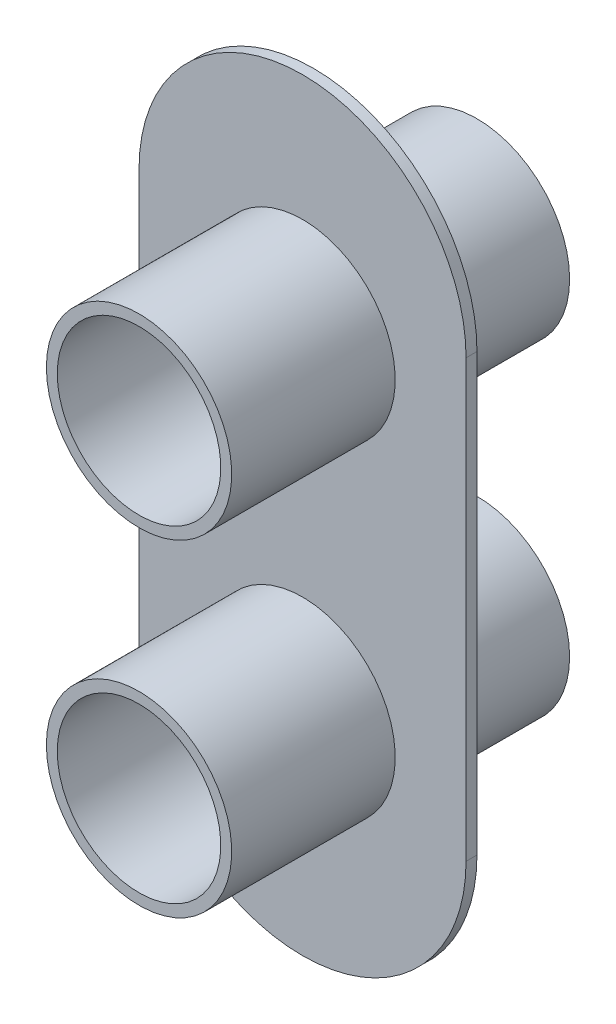
ISO-10303-21;
HEADER;
FILE_DESCRIPTION(('STEP AP214'),'2;1');
FILE_NAME('part.step','',(''),(''),'','','');
FILE_SCHEMA(('AUTOMOTIVE_DESIGN { 1 0 10303 214 1 1 1 1 }'));
ENDSEC;
DATA;
#1=APPLICATION_CONTEXT('core data for automotive mechanical design processes');
#2=APPLICATION_PROTOCOL_DEFINITION('international standard','automotive_design',2000,#1);
#3=PRODUCT_CONTEXT('',#1,'mechanical');
#4=PRODUCT('Part','Part','',(#3));
#5=PRODUCT_RELATED_PRODUCT_CATEGORY('part','',(#4));
#6=PRODUCT_DEFINITION_FORMATION('','',#4);
#7=PRODUCT_DEFINITION_CONTEXT('part definition',#1,'design');
#8=PRODUCT_DEFINITION('design','',#6,#7);
#9=PRODUCT_DEFINITION_SHAPE('','',#8);
#10=(LENGTH_UNIT() NAMED_UNIT(*) SI_UNIT(.MILLI.,.METRE.));
#11=(NAMED_UNIT(*) PLANE_ANGLE_UNIT() SI_UNIT($,.RADIAN.));
#12=(NAMED_UNIT(*) SI_UNIT($,.STERADIAN.) SOLID_ANGLE_UNIT());
#13=UNCERTAINTY_MEASURE_WITH_UNIT(LENGTH_MEASURE(1.E-05),#10,'distance_accuracy_value','');
#14=(GEOMETRIC_REPRESENTATION_CONTEXT(3) GLOBAL_UNCERTAINTY_ASSIGNED_CONTEXT((#13)) GLOBAL_UNIT_ASSIGNED_CONTEXT((#10,
#11,#12)) REPRESENTATION_CONTEXT('',''));
#15=CARTESIAN_POINT('',(0.,0.,0.));
#16=DIRECTION('',(0.,0.,1.));
#17=DIRECTION('',(1.,0.,0.));
#18=AXIS2_PLACEMENT_3D('',#15,#16,#17);
#19=CARTESIAN_POINT('',(0.,50.8,2.54));
#20=DIRECTION('',(0.,0.,-1.));
#21=DIRECTION('',(-1.,0.,0.));
#22=AXIS2_PLACEMENT_3D('',#19,#20,#21);
#23=CYLINDRICAL_SURFACE('',#22,38.1);
#24=CARTESIAN_POINT('',(0.,50.8,0.));
#25=DIRECTION('',(0.,0.,1.));
#26=DIRECTION('',(1.,0.,0.));
#27=AXIS2_PLACEMENT_3D('',#24,#25,#26);
#28=CIRCLE('',#27,38.1);
#29=CARTESIAN_POINT('',(38.1,50.8,0.));
#30=VERTEX_POINT('',#29);
#31=CARTESIAN_POINT('',(-38.1,50.8,0.));
#32=VERTEX_POINT('',#31);
#33=EDGE_CURVE('E106',#30,#32,#28,.T.);
#34=ORIENTED_EDGE('',*,*,#33,.T.);
#35=DIRECTION('',(0.,0.,-1.));
#36=VECTOR('',#35,1.);
#37=CARTESIAN_POINT('',(-38.1,50.8,2.54));
#38=LINE('',#37,#36);
#39=CARTESIAN_POINT('',(-38.1,50.8,2.54));
#40=VERTEX_POINT('',#39);
#41=EDGE_CURVE('E97',#40,#32,#38,.T.);
#42=ORIENTED_EDGE('',*,*,#41,.F.);
#43=CARTESIAN_POINT('',(0.,50.8,2.54));
#44=DIRECTION('',(0.,0.,1.));
#45=DIRECTION('',(1.,0.,0.));
#46=AXIS2_PLACEMENT_3D('',#43,#44,#45);
#47=CIRCLE('',#46,38.1);
#48=CARTESIAN_POINT('',(38.1,50.8,2.54));
#49=VERTEX_POINT('',#48);
#50=EDGE_CURVE('E91',#49,#40,#47,.T.);
#51=ORIENTED_EDGE('',*,*,#50,.F.);
#52=DIRECTION('',(0.,0.,-1.));
#53=VECTOR('',#52,1.);
#54=CARTESIAN_POINT('',(38.1,50.8,2.54));
#55=LINE('',#54,#53);
#56=EDGE_CURVE('E102',#49,#30,#55,.T.);
#57=ORIENTED_EDGE('',*,*,#56,.T.);
#58=EDGE_LOOP('',(#34,#42,#51,#57));
#59=FACE_BOUND('',#58,.T.);
#60=ADVANCED_FACE('F39',(#59),#23,.T.);
#61=CARTESIAN_POINT('',(-38.1,0.,2.54));
#62=DIRECTION('',(1.,0.,0.));
#63=DIRECTION('',(0.,1.,0.));
#64=AXIS2_PLACEMENT_3D('',#61,#62,#63);
#65=PLANE('',#64);
#66=DIRECTION('',(0.,-1.,0.));
#67=VECTOR('',#66,1.);
#68=CARTESIAN_POINT('',(-38.1,0.,0.));
#69=LINE('',#68,#67);
#70=CARTESIAN_POINT('',(-38.1,-50.8,0.));
#71=VERTEX_POINT('',#70);
#72=EDGE_CURVE('E96',#32,#71,#69,.T.);
#73=ORIENTED_EDGE('',*,*,#72,.T.);
#74=DIRECTION('',(0.,0.,-1.));
#75=VECTOR('',#74,1.);
#76=CARTESIAN_POINT('',(-38.1,-50.8,2.54));
#77=LINE('',#76,#75);
#78=CARTESIAN_POINT('',(-38.1,-50.8,2.54));
#79=VERTEX_POINT('',#78);
#80=EDGE_CURVE('E94',#79,#71,#77,.T.);
#81=ORIENTED_EDGE('',*,*,#80,.F.);
#82=DIRECTION('',(0.,-1.,0.));
#83=VECTOR('',#82,1.);
#84=CARTESIAN_POINT('',(-38.1,0.,2.54));
#85=LINE('',#84,#83);
#86=EDGE_CURVE('E86',#40,#79,#85,.T.);
#87=ORIENTED_EDGE('',*,*,#86,.F.);
#88=ORIENTED_EDGE('',*,*,#41,.T.);
#89=EDGE_LOOP('',(#73,#81,#87,#88));
#90=FACE_BOUND('',#89,.T.);
#91=ADVANCED_FACE('F95',(#90),#65,.F.);
#92=CARTESIAN_POINT('',(0.,-50.8,2.54));
#93=DIRECTION('',(0.,0.,-1.));
#94=DIRECTION('',(-1.,0.,0.));
#95=AXIS2_PLACEMENT_3D('',#92,#93,#94);
#96=CYLINDRICAL_SURFACE('',#95,38.1);
#97=CARTESIAN_POINT('',(0.,-50.8,0.));
#98=DIRECTION('',(0.,0.,1.));
#99=DIRECTION('',(1.,0.,0.));
#100=AXIS2_PLACEMENT_3D('',#97,#98,#99);
#101=CIRCLE('',#100,38.1);
#102=CARTESIAN_POINT('',(38.1,-50.8,0.));
#103=VERTEX_POINT('',#102);
#104=EDGE_CURVE('E72',#71,#103,#101,.T.);
#105=ORIENTED_EDGE('',*,*,#104,.T.);
#106=DIRECTION('',(0.,0.,-1.));
#107=VECTOR('',#106,1.);
#108=CARTESIAN_POINT('',(38.1,-50.8,2.54));
#109=LINE('',#108,#107);
#110=CARTESIAN_POINT('',(38.1,-50.8,2.54));
#111=VERTEX_POINT('',#110);
#112=EDGE_CURVE('E98',#111,#103,#109,.T.);
#113=ORIENTED_EDGE('',*,*,#112,.F.);
#114=CARTESIAN_POINT('',(0.,-50.8,2.54));
#115=DIRECTION('',(0.,0.,1.));
#116=DIRECTION('',(1.,0.,0.));
#117=AXIS2_PLACEMENT_3D('',#114,#115,#116);
#118=CIRCLE('',#117,38.1);
#119=EDGE_CURVE('E89',#79,#111,#118,.T.);
#120=ORIENTED_EDGE('',*,*,#119,.F.);
#121=ORIENTED_EDGE('',*,*,#80,.T.);
#122=EDGE_LOOP('',(#105,#113,#120,#121));
#123=FACE_BOUND('',#122,.T.);
#124=ADVANCED_FACE('F100',(#123),#96,.T.);
#125=CARTESIAN_POINT('',(38.1,0.,2.54));
#126=DIRECTION('',(-1.,0.,0.));
#127=DIRECTION('',(0.,0.,1.));
#128=AXIS2_PLACEMENT_3D('',#125,#126,#127);
#129=PLANE('',#128);
#130=DIRECTION('',(0.,1.,0.));
#131=VECTOR('',#130,1.);
#132=CARTESIAN_POINT('',(38.1,0.,0.));
#133=LINE('',#132,#131);
#134=EDGE_CURVE('E78',#103,#30,#133,.T.);
#135=ORIENTED_EDGE('',*,*,#134,.T.);
#136=ORIENTED_EDGE('',*,*,#56,.F.);
#137=DIRECTION('',(0.,1.,0.));
#138=VECTOR('',#137,1.);
#139=CARTESIAN_POINT('',(38.1,0.,2.54));
#140=LINE('',#139,#138);
#141=EDGE_CURVE('E55',#111,#49,#140,.T.);
#142=ORIENTED_EDGE('',*,*,#141,.F.);
#143=ORIENTED_EDGE('',*,*,#112,.T.);
#144=EDGE_LOOP('',(#135,#136,#142,#143));
#145=FACE_BOUND('',#144,.T.);
#146=ADVANCED_FACE('F131',(#145),#129,.F.);
#147=CARTESIAN_POINT('',(0.,0.,2.54));
#148=DIRECTION('',(0.,0.,1.));
#149=DIRECTION('',(1.,0.,0.));
#150=AXIS2_PLACEMENT_3D('',#147,#148,#149);
#151=PLANE('',#150);
#152=CARTESIAN_POINT('',(0.,38.1,2.54));
#153=DIRECTION('',(0.,0.,1.));
#154=DIRECTION('',(1.,0.,0.));
#155=AXIS2_PLACEMENT_3D('',#152,#153,#154);
#156=CIRCLE('',#155,21.59);
#157=CARTESIAN_POINT('',(-21.59,38.1,2.54));
#158=VERTEX_POINT('',#157);
#159=EDGE_CURVE('E284',#158,#158,#156,.T.);
#160=ORIENTED_EDGE('',*,*,#159,.F.);
#161=EDGE_LOOP('',(#160));
#162=FACE_BOUND('',#161,.T.);
#163=CARTESIAN_POINT('',(0.,-38.1,2.54));
#164=DIRECTION('',(0.,0.,1.));
#165=DIRECTION('',(1.,0.,0.));
#166=AXIS2_PLACEMENT_3D('',#163,#164,#165);
#167=CIRCLE('',#166,21.59);
#168=CARTESIAN_POINT('',(-21.59,-38.1,2.54));
#169=VERTEX_POINT('',#168);
#170=EDGE_CURVE('E11',#169,#169,#167,.T.);
#171=ORIENTED_EDGE('',*,*,#170,.F.);
#172=EDGE_LOOP('',(#171));
#173=FACE_BOUND('',#172,.T.);
#174=ORIENTED_EDGE('',*,*,#50,.T.);
#175=ORIENTED_EDGE('',*,*,#86,.T.);
#176=ORIENTED_EDGE('',*,*,#119,.T.);
#177=ORIENTED_EDGE('',*,*,#141,.T.);
#178=EDGE_LOOP('',(#174,#175,#176,#177));
#179=FACE_BOUND('',#178,.T.);
#180=ADVANCED_FACE('F87',(#162,#173,#179),#151,.T.);
#181=CARTESIAN_POINT('',(0.,0.,0.));
#182=DIRECTION('',(0.,0.,1.));
#183=DIRECTION('',(1.,0.,0.));
#184=AXIS2_PLACEMENT_3D('',#181,#182,#183);
#185=PLANE('',#184);
#186=CARTESIAN_POINT('',(0.,38.1,0.));
#187=DIRECTION('',(0.,0.,1.));
#188=DIRECTION('',(1.,0.,0.));
#189=AXIS2_PLACEMENT_3D('',#186,#187,#188);
#190=CIRCLE('',#189,21.59);
#191=CARTESIAN_POINT('',(21.59,38.1,0.));
#192=VERTEX_POINT('',#191);
#193=EDGE_CURVE('E47',#192,#192,#190,.F.);
#194=ORIENTED_EDGE('',*,*,#193,.F.);
#195=EDGE_LOOP('',(#194));
#196=FACE_BOUND('',#195,.T.);
#197=CARTESIAN_POINT('',(0.,-38.1,0.));
#198=DIRECTION('',(0.,0.,1.));
#199=DIRECTION('',(1.,0.,0.));
#200=AXIS2_PLACEMENT_3D('',#197,#198,#199);
#201=CIRCLE('',#200,21.59);
#202=CARTESIAN_POINT('',(21.59,-38.1,0.));
#203=VERTEX_POINT('',#202);
#204=EDGE_CURVE('E128',#203,#203,#201,.T.);
#205=ORIENTED_EDGE('',*,*,#204,.T.);
#206=EDGE_LOOP('',(#205));
#207=FACE_BOUND('',#206,.T.);
#208=ORIENTED_EDGE('',*,*,#33,.F.);
#209=ORIENTED_EDGE('',*,*,#134,.F.);
#210=ORIENTED_EDGE('',*,*,#104,.F.);
#211=ORIENTED_EDGE('',*,*,#72,.F.);
#212=EDGE_LOOP('',(#208,#209,#210,#211));
#213=FACE_BOUND('',#212,.T.);
#214=ADVANCED_FACE('F120',(#196,#207,#213),#185,.F.);
#215=CARTESIAN_POINT('',(0.,-38.1,-38.1));
#216=DIRECTION('',(0.,0.,1.));
#217=DIRECTION('',(1.,0.,0.));
#218=AXIS2_PLACEMENT_3D('',#215,#216,#217);
#219=CYLINDRICAL_SURFACE('',#218,21.59);
#220=CARTESIAN_POINT('',(0.,-38.1,-38.1));
#221=DIRECTION('',(0.,0.,1.));
#222=DIRECTION('',(1.,0.,0.));
#223=AXIS2_PLACEMENT_3D('',#220,#221,#222);
#224=CIRCLE('',#223,21.59);
#225=CARTESIAN_POINT('',(21.59,-38.1,-38.1));
#226=VERTEX_POINT('',#225);
#227=EDGE_CURVE('E109',#226,#226,#224,.T.);
#228=CARTESIAN_POINT('',(21.59,-38.1,-38.1));
#229=CARTESIAN_POINT('',(21.59,-38.1,-37.703125));
#230=CARTESIAN_POINT('',(21.59,-38.1,-37.30625));
#231=CARTESIAN_POINT('',(21.59,-38.1,-36.5125));
#232=CARTESIAN_POINT('',(21.59,-38.1,-36.115625));
#233=CARTESIAN_POINT('',(21.59,-38.1,-35.321875));
#234=CARTESIAN_POINT('',(21.59,-38.1,-34.925));
#235=CARTESIAN_POINT('',(21.59,-38.1,-34.13125));
#236=CARTESIAN_POINT('',(21.59,-38.1,-33.734375));
#237=CARTESIAN_POINT('',(21.59,-38.1,-32.940625));
#238=CARTESIAN_POINT('',(21.59,-38.1,-32.54375));
#239=CARTESIAN_POINT('',(21.59,-38.1,-31.75));
#240=CARTESIAN_POINT('',(21.59,-38.1,-31.353125));
#241=CARTESIAN_POINT('',(21.59,-38.1,-30.559375));
#242=CARTESIAN_POINT('',(21.59,-38.1,-30.1625));
#243=CARTESIAN_POINT('',(21.59,-38.1,-29.36875));
#244=CARTESIAN_POINT('',(21.59,-38.1,-28.971875));
#245=CARTESIAN_POINT('',(21.59,-38.1,-28.178125));
#246=CARTESIAN_POINT('',(21.59,-38.1,-27.78125));
#247=CARTESIAN_POINT('',(21.59,-38.1,-26.9875));
#248=CARTESIAN_POINT('',(21.59,-38.1,-26.590625));
#249=CARTESIAN_POINT('',(21.59,-38.1,-25.796875));
#250=CARTESIAN_POINT('',(21.59,-38.1,-25.4));
#251=CARTESIAN_POINT('',(21.59,-38.1,-24.60625));
#252=CARTESIAN_POINT('',(21.59,-38.1,-24.209375));
#253=CARTESIAN_POINT('',(21.59,-38.1,-23.415625));
#254=CARTESIAN_POINT('',(21.59,-38.1,-23.01875));
#255=CARTESIAN_POINT('',(21.59,-38.1,-22.225));
#256=CARTESIAN_POINT('',(21.59,-38.1,-21.828125));
#257=CARTESIAN_POINT('',(21.59,-38.1,-21.034375));
#258=CARTESIAN_POINT('',(21.59,-38.1,-20.6375));
#259=CARTESIAN_POINT('',(21.59,-38.1,-19.84375));
#260=CARTESIAN_POINT('',(21.59,-38.1,-19.446875));
#261=CARTESIAN_POINT('',(21.59,-38.1,-18.653125));
#262=CARTESIAN_POINT('',(21.59,-38.1,-18.25625));
#263=CARTESIAN_POINT('',(21.59,-38.1,-17.4625));
#264=CARTESIAN_POINT('',(21.59,-38.1,-17.065625));
#265=CARTESIAN_POINT('',(21.59,-38.1,-16.271875));
#266=CARTESIAN_POINT('',(21.59,-38.1,-15.875));
#267=CARTESIAN_POINT('',(21.59,-38.1,-15.08125));
#268=CARTESIAN_POINT('',(21.59,-38.1,-14.684375));
#269=CARTESIAN_POINT('',(21.59,-38.1,-13.890625));
#270=CARTESIAN_POINT('',(21.59,-38.1,-13.49375));
#271=CARTESIAN_POINT('',(21.59,-38.1,-12.7));
#272=CARTESIAN_POINT('',(21.59,-38.1,-12.303125));
#273=CARTESIAN_POINT('',(21.59,-38.1,-11.509375));
#274=CARTESIAN_POINT('',(21.59,-38.1,-11.1125));
#275=CARTESIAN_POINT('',(21.59,-38.1,-10.31875));
#276=CARTESIAN_POINT('',(21.59,-38.1,-9.921875));
#277=CARTESIAN_POINT('',(21.59,-38.1,-9.128125));
#278=CARTESIAN_POINT('',(21.59,-38.1,-8.73125));
#279=CARTESIAN_POINT('',(21.59,-38.1,-7.9375));
#280=CARTESIAN_POINT('',(21.59,-38.1,-7.540625));
#281=CARTESIAN_POINT('',(21.59,-38.1,-6.746875));
#282=CARTESIAN_POINT('',(21.59,-38.1,-6.35));
#283=CARTESIAN_POINT('',(21.59,-38.1,-5.55625));
#284=CARTESIAN_POINT('',(21.59,-38.1,-5.159375));
#285=CARTESIAN_POINT('',(21.59,-38.1,-4.365625));
#286=CARTESIAN_POINT('',(21.59,-38.1,-3.96875));
#287=CARTESIAN_POINT('',(21.59,-38.1,-3.175));
#288=CARTESIAN_POINT('',(21.59,-38.1,-2.778125));
#289=CARTESIAN_POINT('',(21.59,-38.1,-1.984375));
#290=CARTESIAN_POINT('',(21.59,-38.1,-1.5875));
#291=CARTESIAN_POINT('',(21.59,-38.1,-0.79375));
#292=CARTESIAN_POINT('',(21.59,-38.1,-0.396875));
#293=CARTESIAN_POINT('',(21.59,-38.1,0.));
#294=B_SPLINE_CURVE_WITH_KNOTS('',3,(#228,#229,#230,#231,#232,#233,#234,#235,#236,#237,#238,
#239,#240,#241,#242,#243,#244,#245,#246,#247,#248,#249,#250,#251,#252,#253,#254,#255,#256,#257,
#258,#259,#260,#261,#262,#263,#264,#265,#266,#267,#268,#269,#270,#271,#272,#273,#274,#275,#276,
#277,#278,#279,#280,#281,#282,#283,#284,#285,#286,#287,#288,#289,#290,#291,#292,#293),
.UNSPECIFIED.,.F.,.F.,(4,2,2,2,2,2,2,2,2,2,2,2,2,2,2,2,2,2,2,2,2,2,2,2,2,2,2,2,2,2,2,2,4),(0.,
1.19062499999999,2.38124999999999,3.571875,4.7625,5.953125,7.14375,8.334375,9.525,10.715625,
11.90625,13.096875,14.2875,15.478125,16.66875,17.859375,19.05,20.240625,21.43125,22.621875,
23.8125,25.003125,26.19375,27.384375,28.575,29.765625,30.95625,32.146875,33.3375,34.528125,
35.71875,36.909375,38.1),.UNSPECIFIED.);
#295=EDGE_CURVE('BSEAM123',#226,#203,#294,.T.);
#296=ORIENTED_EDGE('',*,*,#227,.T.);
#297=ORIENTED_EDGE('',*,*,#204,.F.);
#298=ORIENTED_EDGE('',*,*,#295,.T.);
#299=ORIENTED_EDGE('',*,*,#295,.F.);
#300=EDGE_LOOP('',(#296,#298,#297,#299));
#301=FACE_BOUND('',#300,.T.);
#302=ADVANCED_FACE('F123',(#301),#219,.T.);
#303=CARTESIAN_POINT('',(0.,-38.1,-38.1));
#304=DIRECTION('',(0.,0.,1.));
#305=DIRECTION('',(1.,0.,0.));
#306=AXIS2_PLACEMENT_3D('',#303,#304,#305);
#307=PLANE('',#306);
#308=CARTESIAN_POINT('',(0.,-38.1,-38.1));
#309=DIRECTION('',(0.,0.,1.));
#310=DIRECTION('',(1.,0.,0.));
#311=AXIS2_PLACEMENT_3D('',#308,#309,#310);
#312=CIRCLE('',#311,19.05);
#313=CARTESIAN_POINT('',(19.05,-38.1,-38.1));
#314=VERTEX_POINT('',#313);
#315=EDGE_CURVE('E279',#314,#314,#312,.T.);
#316=ORIENTED_EDGE('',*,*,#315,.T.);
#317=EDGE_LOOP('',(#316));
#318=FACE_BOUND('',#317,.T.);
#319=ORIENTED_EDGE('',*,*,#227,.F.);
#320=EDGE_LOOP('',(#319));
#321=FACE_BOUND('',#320,.T.);
#322=ADVANCED_FACE('F172',(#318,#321),#307,.F.);
#323=CARTESIAN_POINT('',(0.,38.1,-38.1));
#324=DIRECTION('',(0.,0.,1.));
#325=DIRECTION('',(1.,0.,0.));
#326=AXIS2_PLACEMENT_3D('',#323,#324,#325);
#327=CYLINDRICAL_SURFACE('',#326,21.59);
#328=CARTESIAN_POINT('',(0.,38.1,-38.1));
#329=DIRECTION('',(0.,0.,-1.));
#330=DIRECTION('',(-1.,0.,0.));
#331=AXIS2_PLACEMENT_3D('',#328,#329,#330);
#332=CIRCLE('',#331,21.59);
#333=CARTESIAN_POINT('',(21.59,38.1,-38.1));
#334=VERTEX_POINT('',#333);
#335=EDGE_CURVE('E296',#334,#334,#332,.T.);
#336=CARTESIAN_POINT('',(21.59,38.1,-38.1));
#337=CARTESIAN_POINT('',(21.59,38.1,-37.703125));
#338=CARTESIAN_POINT('',(21.59,38.1,-37.30625));
#339=CARTESIAN_POINT('',(21.59,38.1,-36.5125));
#340=CARTESIAN_POINT('',(21.59,38.1,-36.115625));
#341=CARTESIAN_POINT('',(21.59,38.1,-35.321875));
#342=CARTESIAN_POINT('',(21.59,38.1,-34.925));
#343=CARTESIAN_POINT('',(21.59,38.1,-34.13125));
#344=CARTESIAN_POINT('',(21.59,38.1,-33.734375));
#345=CARTESIAN_POINT('',(21.59,38.1,-32.940625));
#346=CARTESIAN_POINT('',(21.59,38.1,-32.54375));
#347=CARTESIAN_POINT('',(21.59,38.1,-31.75));
#348=CARTESIAN_POINT('',(21.59,38.1,-31.353125));
#349=CARTESIAN_POINT('',(21.59,38.1,-30.559375));
#350=CARTESIAN_POINT('',(21.59,38.1,-30.1625));
#351=CARTESIAN_POINT('',(21.59,38.1,-29.36875));
#352=CARTESIAN_POINT('',(21.59,38.1,-28.971875));
#353=CARTESIAN_POINT('',(21.59,38.1,-28.178125));
#354=CARTESIAN_POINT('',(21.59,38.1,-27.78125));
#355=CARTESIAN_POINT('',(21.59,38.1,-26.9875));
#356=CARTESIAN_POINT('',(21.59,38.1,-26.590625));
#357=CARTESIAN_POINT('',(21.59,38.1,-25.796875));
#358=CARTESIAN_POINT('',(21.59,38.1,-25.4));
#359=CARTESIAN_POINT('',(21.59,38.1,-24.60625));
#360=CARTESIAN_POINT('',(21.59,38.1,-24.209375));
#361=CARTESIAN_POINT('',(21.59,38.1,-23.415625));
#362=CARTESIAN_POINT('',(21.59,38.1,-23.01875));
#363=CARTESIAN_POINT('',(21.59,38.1,-22.225));
#364=CARTESIAN_POINT('',(21.59,38.1,-21.828125));
#365=CARTESIAN_POINT('',(21.59,38.1,-21.034375));
#366=CARTESIAN_POINT('',(21.59,38.1,-20.6375));
#367=CARTESIAN_POINT('',(21.59,38.1,-19.84375));
#368=CARTESIAN_POINT('',(21.59,38.1,-19.446875));
#369=CARTESIAN_POINT('',(21.59,38.1,-18.653125));
#370=CARTESIAN_POINT('',(21.59,38.1,-18.25625));
#371=CARTESIAN_POINT('',(21.59,38.1,-17.4625));
#372=CARTESIAN_POINT('',(21.59,38.1,-17.065625));
#373=CARTESIAN_POINT('',(21.59,38.1,-16.271875));
#374=CARTESIAN_POINT('',(21.59,38.1,-15.875));
#375=CARTESIAN_POINT('',(21.59,38.1,-15.08125));
#376=CARTESIAN_POINT('',(21.59,38.1,-14.684375));
#377=CARTESIAN_POINT('',(21.59,38.1,-13.890625));
#378=CARTESIAN_POINT('',(21.59,38.1,-13.49375));
#379=CARTESIAN_POINT('',(21.59,38.1,-12.7));
#380=CARTESIAN_POINT('',(21.59,38.1,-12.303125));
#381=CARTESIAN_POINT('',(21.59,38.1,-11.509375));
#382=CARTESIAN_POINT('',(21.59,38.1,-11.1125));
#383=CARTESIAN_POINT('',(21.59,38.1,-10.31875));
#384=CARTESIAN_POINT('',(21.59,38.1,-9.92187499999999));
#385=CARTESIAN_POINT('',(21.59,38.1,-9.128125));
#386=CARTESIAN_POINT('',(21.59,38.1,-8.73124999999999));
#387=CARTESIAN_POINT('',(21.59,38.1,-7.93749999999999));
#388=CARTESIAN_POINT('',(21.59,38.1,-7.54062499999999));
#389=CARTESIAN_POINT('',(21.59,38.1,-6.746875));
#390=CARTESIAN_POINT('',(21.59,38.1,-6.35));
#391=CARTESIAN_POINT('',(21.59,38.1,-5.55625));
#392=CARTESIAN_POINT('',(21.59,38.1,-5.159375));
#393=CARTESIAN_POINT('',(21.59,38.1,-4.365625));
#394=CARTESIAN_POINT('',(21.59,38.1,-3.96875));
#395=CARTESIAN_POINT('',(21.59,38.1,-3.175));
#396=CARTESIAN_POINT('',(21.59,38.1,-2.778125));
#397=CARTESIAN_POINT('',(21.59,38.1,-1.984375));
#398=CARTESIAN_POINT('',(21.59,38.1,-1.5875));
#399=CARTESIAN_POINT('',(21.59,38.1,-0.79375));
#400=CARTESIAN_POINT('',(21.59,38.1,-0.396875));
#401=CARTESIAN_POINT('',(21.59,38.1,0.));
#402=B_SPLINE_CURVE_WITH_KNOTS('',3,(#336,#337,#338,#339,#340,#341,#342,#343,#344,#345,#346,
#347,#348,#349,#350,#351,#352,#353,#354,#355,#356,#357,#358,#359,#360,#361,#362,#363,#364,#365,
#366,#367,#368,#369,#370,#371,#372,#373,#374,#375,#376,#377,#378,#379,#380,#381,#382,#383,#384,
#385,#386,#387,#388,#389,#390,#391,#392,#393,#394,#395,#396,#397,#398,#399,#400,#401),
.UNSPECIFIED.,.F.,.F.,(4,2,2,2,2,2,2,2,2,2,2,2,2,2,2,2,2,2,2,2,2,2,2,2,2,2,2,2,2,2,2,2,4),(0.,
1.190625,2.38125,3.571875,4.7625,5.953125,7.14375,8.334375,9.52500000000001,10.715625,11.90625,
13.096875,14.2875,15.478125,16.66875,17.859375,19.05,20.240625,21.43125,22.621875,23.8125,
25.003125,26.19375,27.384375,28.575,29.765625,30.95625,32.146875,33.3375,34.528125,35.71875,
36.909375,38.1),.UNSPECIFIED.);
#403=EDGE_CURVE('BSEAM118',#334,#192,#402,.T.);
#404=ORIENTED_EDGE('',*,*,#335,.F.);
#405=ORIENTED_EDGE('',*,*,#193,.T.);
#406=ORIENTED_EDGE('',*,*,#403,.T.);
#407=ORIENTED_EDGE('',*,*,#403,.F.);
#408=EDGE_LOOP('',(#404,#406,#405,#407));
#409=FACE_BOUND('',#408,.T.);
#410=ADVANCED_FACE('F118',(#409),#327,.T.);
#411=CARTESIAN_POINT('',(0.,38.1,-38.1));
#412=DIRECTION('',(0.,0.,-1.));
#413=DIRECTION('',(-1.,0.,0.));
#414=AXIS2_PLACEMENT_3D('',#411,#412,#413);
#415=PLANE('',#414);
#416=CARTESIAN_POINT('',(0.,38.1,-38.1));
#417=DIRECTION('',(0.,0.,-1.));
#418=DIRECTION('',(-1.,0.,0.));
#419=AXIS2_PLACEMENT_3D('',#416,#417,#418);
#420=CIRCLE('',#419,19.05);
#421=CARTESIAN_POINT('',(-19.05,38.1,-38.1));
#422=VERTEX_POINT('',#421);
#423=EDGE_CURVE('E281',#422,#422,#420,.T.);
#424=ORIENTED_EDGE('',*,*,#423,.F.);
#425=EDGE_LOOP('',(#424));
#426=FACE_BOUND('',#425,.T.);
#427=ORIENTED_EDGE('',*,*,#335,.T.);
#428=EDGE_LOOP('',(#427));
#429=FACE_BOUND('',#428,.T.);
#430=ADVANCED_FACE('F184',(#426,#429),#415,.T.);
#431=CARTESIAN_POINT('',(0.,-38.1,40.64));
#432=DIRECTION('',(0.,0.,-1.));
#433=DIRECTION('',(-1.,0.,0.));
#434=AXIS2_PLACEMENT_3D('',#431,#432,#433);
#435=CYLINDRICAL_SURFACE('',#434,21.59);
#436=CARTESIAN_POINT('',(0.,-38.1,40.64));
#437=DIRECTION('',(0.,0.,-1.));
#438=DIRECTION('',(-1.,0.,0.));
#439=AXIS2_PLACEMENT_3D('',#436,#437,#438);
#440=CIRCLE('',#439,21.59);
#441=CARTESIAN_POINT('',(-21.59,-38.1,40.64));
#442=VERTEX_POINT('',#441);
#443=EDGE_CURVE('E292',#442,#442,#440,.T.);
#444=CARTESIAN_POINT('',(-21.59,-38.1,40.64));
#445=CARTESIAN_POINT('',(-21.59,-38.1,40.243125));
#446=CARTESIAN_POINT('',(-21.59,-38.1,39.84625));
#447=CARTESIAN_POINT('',(-21.59,-38.1,39.0525));
#448=CARTESIAN_POINT('',(-21.59,-38.1,38.655625));
#449=CARTESIAN_POINT('',(-21.59,-38.1,37.861875));
#450=CARTESIAN_POINT('',(-21.59,-38.1,37.465));
#451=CARTESIAN_POINT('',(-21.59,-38.1,36.67125));
#452=CARTESIAN_POINT('',(-21.59,-38.1,36.274375));
#453=CARTESIAN_POINT('',(-21.59,-38.1,35.480625));
#454=CARTESIAN_POINT('',(-21.59,-38.1,35.08375));
#455=CARTESIAN_POINT('',(-21.59,-38.1,34.29));
#456=CARTESIAN_POINT('',(-21.59,-38.1,33.893125));
#457=CARTESIAN_POINT('',(-21.59,-38.1,33.099375));
#458=CARTESIAN_POINT('',(-21.59,-38.1,32.7025));
#459=CARTESIAN_POINT('',(-21.59,-38.1,31.90875));
#460=CARTESIAN_POINT('',(-21.59,-38.1,31.511875));
#461=CARTESIAN_POINT('',(-21.59,-38.1,30.718125));
#462=CARTESIAN_POINT('',(-21.59,-38.1,30.32125));
#463=CARTESIAN_POINT('',(-21.59,-38.1,29.5275));
#464=CARTESIAN_POINT('',(-21.59,-38.1,29.130625));
#465=CARTESIAN_POINT('',(-21.59,-38.1,28.336875));
#466=CARTESIAN_POINT('',(-21.59,-38.1,27.94));
#467=CARTESIAN_POINT('',(-21.59,-38.1,27.14625));
#468=CARTESIAN_POINT('',(-21.59,-38.1,26.749375));
#469=CARTESIAN_POINT('',(-21.59,-38.1,25.955625));
#470=CARTESIAN_POINT('',(-21.59,-38.1,25.55875));
#471=CARTESIAN_POINT('',(-21.59,-38.1,24.765));
#472=CARTESIAN_POINT('',(-21.59,-38.1,24.368125));
#473=CARTESIAN_POINT('',(-21.59,-38.1,23.574375));
#474=CARTESIAN_POINT('',(-21.59,-38.1,23.1775));
#475=CARTESIAN_POINT('',(-21.59,-38.1,22.38375));
#476=CARTESIAN_POINT('',(-21.59,-38.1,21.986875));
#477=CARTESIAN_POINT('',(-21.59,-38.1,21.193125));
#478=CARTESIAN_POINT('',(-21.59,-38.1,20.79625));
#479=CARTESIAN_POINT('',(-21.59,-38.1,20.0025));
#480=CARTESIAN_POINT('',(-21.59,-38.1,19.605625));
#481=CARTESIAN_POINT('',(-21.59,-38.1,18.811875));
#482=CARTESIAN_POINT('',(-21.59,-38.1,18.415));
#483=CARTESIAN_POINT('',(-21.59,-38.1,17.62125));
#484=CARTESIAN_POINT('',(-21.59,-38.1,17.224375));
#485=CARTESIAN_POINT('',(-21.59,-38.1,16.430625));
#486=CARTESIAN_POINT('',(-21.59,-38.1,16.03375));
#487=CARTESIAN_POINT('',(-21.59,-38.1,15.24));
#488=CARTESIAN_POINT('',(-21.59,-38.1,14.843125));
#489=CARTESIAN_POINT('',(-21.59,-38.1,14.049375));
#490=CARTESIAN_POINT('',(-21.59,-38.1,13.6525));
#491=CARTESIAN_POINT('',(-21.59,-38.1,12.85875));
#492=CARTESIAN_POINT('',(-21.59,-38.1,12.461875));
#493=CARTESIAN_POINT('',(-21.59,-38.1,11.668125));
#494=CARTESIAN_POINT('',(-21.59,-38.1,11.27125));
#495=CARTESIAN_POINT('',(-21.59,-38.1,10.4775));
#496=CARTESIAN_POINT('',(-21.59,-38.1,10.080625));
#497=CARTESIAN_POINT('',(-21.59,-38.1,9.286875));
#498=CARTESIAN_POINT('',(-21.59,-38.1,8.89));
#499=CARTESIAN_POINT('',(-21.59,-38.1,8.09625));
#500=CARTESIAN_POINT('',(-21.59,-38.1,7.699375));
#501=CARTESIAN_POINT('',(-21.59,-38.1,6.905625));
#502=CARTESIAN_POINT('',(-21.59,-38.1,6.50875));
#503=CARTESIAN_POINT('',(-21.59,-38.1,5.715));
#504=CARTESIAN_POINT('',(-21.59,-38.1,5.318125));
#505=CARTESIAN_POINT('',(-21.59,-38.1,4.524375));
#506=CARTESIAN_POINT('',(-21.59,-38.1,4.1275));
#507=CARTESIAN_POINT('',(-21.59,-38.1,3.33375));
#508=CARTESIAN_POINT('',(-21.59,-38.1,2.936875));
#509=CARTESIAN_POINT('',(-21.59,-38.1,2.54));
#510=B_SPLINE_CURVE_WITH_KNOTS('',3,(#444,#445,#446,#447,#448,#449,#450,#451,#452,#453,#454,
#455,#456,#457,#458,#459,#460,#461,#462,#463,#464,#465,#466,#467,#468,#469,#470,#471,#472,#473,
#474,#475,#476,#477,#478,#479,#480,#481,#482,#483,#484,#485,#486,#487,#488,#489,#490,#491,#492,
#493,#494,#495,#496,#497,#498,#499,#500,#501,#502,#503,#504,#505,#506,#507,#508,#509),
.UNSPECIFIED.,.F.,.F.,(4,2,2,2,2,2,2,2,2,2,2,2,2,2,2,2,2,2,2,2,2,2,2,2,2,2,2,2,2,2,2,2,4),(0.,
1.19062499999999,2.38124999999999,3.571875,4.7625,5.953125,7.14375,8.334375,9.525,10.715625,
11.90625,13.096875,14.2875,15.478125,16.66875,17.859375,19.05,20.240625,21.43125,22.621875,
23.8125,25.003125,26.19375,27.384375,28.575,29.765625,30.95625,32.146875,33.3375,34.528125,
35.71875,36.909375,38.1),.UNSPECIFIED.);
#511=EDGE_CURVE('BSEAM200',#442,#169,#510,.T.);
#512=ORIENTED_EDGE('',*,*,#443,.T.);
#513=ORIENTED_EDGE('',*,*,#170,.T.);
#514=ORIENTED_EDGE('',*,*,#511,.T.);
#515=ORIENTED_EDGE('',*,*,#511,.F.);
#516=EDGE_LOOP('',(#512,#514,#513,#515));
#517=FACE_BOUND('',#516,.T.);
#518=ADVANCED_FACE('F200',(#517),#435,.T.);
#519=CARTESIAN_POINT('',(0.,-38.1,40.64));
#520=DIRECTION('',(0.,0.,-1.));
#521=DIRECTION('',(-1.,0.,0.));
#522=AXIS2_PLACEMENT_3D('',#519,#520,#521);
#523=PLANE('',#522);
#524=CARTESIAN_POINT('',(0.,-38.1,40.64));
#525=DIRECTION('',(0.,0.,-1.));
#526=DIRECTION('',(-1.,0.,0.));
#527=AXIS2_PLACEMENT_3D('',#524,#525,#526);
#528=CIRCLE('',#527,19.05);
#529=CARTESIAN_POINT('',(-19.05,-38.1,40.64));
#530=VERTEX_POINT('',#529);
#531=EDGE_CURVE('E276',#530,#530,#528,.T.);
#532=ORIENTED_EDGE('',*,*,#531,.T.);
#533=EDGE_LOOP('',(#532));
#534=FACE_BOUND('',#533,.T.);
#535=ORIENTED_EDGE('',*,*,#443,.F.);
#536=EDGE_LOOP('',(#535));
#537=FACE_BOUND('',#536,.T.);
#538=ADVANCED_FACE('F205',(#534,#537),#523,.F.);
#539=CARTESIAN_POINT('',(0.,38.1,40.64));
#540=DIRECTION('',(0.,0.,-1.));
#541=DIRECTION('',(-1.,0.,0.));
#542=AXIS2_PLACEMENT_3D('',#539,#540,#541);
#543=CYLINDRICAL_SURFACE('',#542,21.59);
#544=CARTESIAN_POINT('',(0.,38.1,40.64));
#545=DIRECTION('',(0.,0.,1.));
#546=DIRECTION('',(1.,0.,0.));
#547=AXIS2_PLACEMENT_3D('',#544,#545,#546);
#548=CIRCLE('',#547,21.59);
#549=CARTESIAN_POINT('',(-21.59,38.1,40.64));
#550=VERTEX_POINT('',#549);
#551=EDGE_CURVE('E280',#550,#550,#548,.T.);
#552=CARTESIAN_POINT('',(-21.59,38.1,40.64));
#553=CARTESIAN_POINT('',(-21.59,38.1,40.243125));
#554=CARTESIAN_POINT('',(-21.59,38.1,39.84625));
#555=CARTESIAN_POINT('',(-21.59,38.1,39.0525));
#556=CARTESIAN_POINT('',(-21.59,38.1,38.655625));
#557=CARTESIAN_POINT('',(-21.59,38.1,37.861875));
#558=CARTESIAN_POINT('',(-21.59,38.1,37.465));
#559=CARTESIAN_POINT('',(-21.59,38.1,36.67125));
#560=CARTESIAN_POINT('',(-21.59,38.1,36.274375));
#561=CARTESIAN_POINT('',(-21.59,38.1,35.480625));
#562=CARTESIAN_POINT('',(-21.59,38.1,35.08375));
#563=CARTESIAN_POINT('',(-21.59,38.1,34.29));
#564=CARTESIAN_POINT('',(-21.59,38.1,33.893125));
#565=CARTESIAN_POINT('',(-21.59,38.1,33.099375));
#566=CARTESIAN_POINT('',(-21.59,38.1,32.7025));
#567=CARTESIAN_POINT('',(-21.59,38.1,31.90875));
#568=CARTESIAN_POINT('',(-21.59,38.1,31.511875));
#569=CARTESIAN_POINT('',(-21.59,38.1,30.718125));
#570=CARTESIAN_POINT('',(-21.59,38.1,30.32125));
#571=CARTESIAN_POINT('',(-21.59,38.1,29.5275));
#572=CARTESIAN_POINT('',(-21.59,38.1,29.130625));
#573=CARTESIAN_POINT('',(-21.59,38.1,28.336875));
#574=CARTESIAN_POINT('',(-21.59,38.1,27.94));
#575=CARTESIAN_POINT('',(-21.59,38.1,27.14625));
#576=CARTESIAN_POINT('',(-21.59,38.1,26.749375));
#577=CARTESIAN_POINT('',(-21.59,38.1,25.955625));
#578=CARTESIAN_POINT('',(-21.59,38.1,25.55875));
#579=CARTESIAN_POINT('',(-21.59,38.1,24.765));
#580=CARTESIAN_POINT('',(-21.59,38.1,24.368125));
#581=CARTESIAN_POINT('',(-21.59,38.1,23.574375));
#582=CARTESIAN_POINT('',(-21.59,38.1,23.1775));
#583=CARTESIAN_POINT('',(-21.59,38.1,22.38375));
#584=CARTESIAN_POINT('',(-21.59,38.1,21.986875));
#585=CARTESIAN_POINT('',(-21.59,38.1,21.193125));
#586=CARTESIAN_POINT('',(-21.59,38.1,20.79625));
#587=CARTESIAN_POINT('',(-21.59,38.1,20.0025));
#588=CARTESIAN_POINT('',(-21.59,38.1,19.605625));
#589=CARTESIAN_POINT('',(-21.59,38.1,18.811875));
#590=CARTESIAN_POINT('',(-21.59,38.1,18.415));
#591=CARTESIAN_POINT('',(-21.59,38.1,17.62125));
#592=CARTESIAN_POINT('',(-21.59,38.1,17.224375));
#593=CARTESIAN_POINT('',(-21.59,38.1,16.430625));
#594=CARTESIAN_POINT('',(-21.59,38.1,16.03375));
#595=CARTESIAN_POINT('',(-21.59,38.1,15.24));
#596=CARTESIAN_POINT('',(-21.59,38.1,14.843125));
#597=CARTESIAN_POINT('',(-21.59,38.1,14.049375));
#598=CARTESIAN_POINT('',(-21.59,38.1,13.6525));
#599=CARTESIAN_POINT('',(-21.59,38.1,12.85875));
#600=CARTESIAN_POINT('',(-21.59,38.1,12.461875));
#601=CARTESIAN_POINT('',(-21.59,38.1,11.668125));
#602=CARTESIAN_POINT('',(-21.59,38.1,11.27125));
#603=CARTESIAN_POINT('',(-21.59,38.1,10.4775));
#604=CARTESIAN_POINT('',(-21.59,38.1,10.080625));
#605=CARTESIAN_POINT('',(-21.59,38.1,9.286875));
#606=CARTESIAN_POINT('',(-21.59,38.1,8.89));
#607=CARTESIAN_POINT('',(-21.59,38.1,8.09625));
#608=CARTESIAN_POINT('',(-21.59,38.1,7.699375));
#609=CARTESIAN_POINT('',(-21.59,38.1,6.905625));
#610=CARTESIAN_POINT('',(-21.59,38.1,6.50875));
#611=CARTESIAN_POINT('',(-21.59,38.1,5.715));
#612=CARTESIAN_POINT('',(-21.59,38.1,5.318125));
#613=CARTESIAN_POINT('',(-21.59,38.1,4.524375));
#614=CARTESIAN_POINT('',(-21.59,38.1,4.1275));
#615=CARTESIAN_POINT('',(-21.59,38.1,3.33375));
#616=CARTESIAN_POINT('',(-21.59,38.1,2.936875));
#617=CARTESIAN_POINT('',(-21.59,38.1,2.54));
#618=B_SPLINE_CURVE_WITH_KNOTS('',3,(#552,#553,#554,#555,#556,#557,#558,#559,#560,#561,#562,
#563,#564,#565,#566,#567,#568,#569,#570,#571,#572,#573,#574,#575,#576,#577,#578,#579,#580,#581,
#582,#583,#584,#585,#586,#587,#588,#589,#590,#591,#592,#593,#594,#595,#596,#597,#598,#599,#600,
#601,#602,#603,#604,#605,#606,#607,#608,#609,#610,#611,#612,#613,#614,#615,#616,#617),
.UNSPECIFIED.,.F.,.F.,(4,2,2,2,2,2,2,2,2,2,2,2,2,2,2,2,2,2,2,2,2,2,2,2,2,2,2,2,2,2,2,2,4),(0.,
1.190625,2.38125,3.571875,4.7625,5.953125,7.14375,8.334375,9.52500000000001,10.715625,11.90625,
13.096875,14.2875,15.478125,16.66875,17.859375,19.05,20.240625,21.43125,22.621875,23.8125,
25.003125,26.19375,27.384375,28.575,29.765625,30.95625,32.146875,33.3375,34.528125,35.71875,
36.909375,38.1),.UNSPECIFIED.);
#619=EDGE_CURVE('BSEAM213',#550,#158,#618,.T.);
#620=ORIENTED_EDGE('',*,*,#551,.F.);
#621=ORIENTED_EDGE('',*,*,#159,.T.);
#622=ORIENTED_EDGE('',*,*,#619,.T.);
#623=ORIENTED_EDGE('',*,*,#619,.F.);
#624=EDGE_LOOP('',(#620,#622,#621,#623));
#625=FACE_BOUND('',#624,.T.);
#626=ADVANCED_FACE('F213',(#625),#543,.T.);
#627=CARTESIAN_POINT('',(0.,38.1,40.64));
#628=DIRECTION('',(0.,0.,1.));
#629=DIRECTION('',(1.,0.,0.));
#630=AXIS2_PLACEMENT_3D('',#627,#628,#629);
#631=PLANE('',#630);
#632=CARTESIAN_POINT('',(0.,38.1,40.64));
#633=DIRECTION('',(0.,0.,-1.));
#634=DIRECTION('',(-1.,0.,0.));
#635=AXIS2_PLACEMENT_3D('',#632,#633,#634);
#636=CIRCLE('',#635,19.05);
#637=CARTESIAN_POINT('',(-19.05,38.1,40.64));
#638=VERTEX_POINT('',#637);
#639=EDGE_CURVE('E287',#638,#638,#636,.T.);
#640=ORIENTED_EDGE('',*,*,#639,.T.);
#641=EDGE_LOOP('',(#640));
#642=FACE_BOUND('',#641,.T.);
#643=ORIENTED_EDGE('',*,*,#551,.T.);
#644=EDGE_LOOP('',(#643));
#645=FACE_BOUND('',#644,.T.);
#646=ADVANCED_FACE('F218',(#642,#645),#631,.T.);
#647=CARTESIAN_POINT('',(0.,38.1,40.64));
#648=DIRECTION('',(0.,0.,-1.));
#649=DIRECTION('',(-1.,0.,0.));
#650=AXIS2_PLACEMENT_3D('',#647,#648,#649);
#651=CYLINDRICAL_SURFACE('',#650,19.05);
#652=ORIENTED_EDGE('',*,*,#423,.T.);
#653=EDGE_LOOP('',(#652));
#654=FACE_BOUND('',#653,.T.);
#655=ORIENTED_EDGE('',*,*,#639,.F.);
#656=EDGE_LOOP('',(#655));
#657=FACE_BOUND('',#656,.T.);
#658=ADVANCED_FACE('F249',(#654,#657),#651,.F.);
#659=CARTESIAN_POINT('',(0.,-38.1,40.64));
#660=DIRECTION('',(0.,0.,-1.));
#661=DIRECTION('',(-1.,0.,0.));
#662=AXIS2_PLACEMENT_3D('',#659,#660,#661);
#663=CYLINDRICAL_SURFACE('',#662,19.05);
#664=ORIENTED_EDGE('',*,*,#531,.F.);
#665=EDGE_LOOP('',(#664));
#666=FACE_BOUND('',#665,.T.);
#667=ORIENTED_EDGE('',*,*,#315,.F.);
#668=EDGE_LOOP('',(#667));
#669=FACE_BOUND('',#668,.T.);
#670=ADVANCED_FACE('F259',(#666,#669),#663,.F.);
#671=CLOSED_SHELL('',(#60,#91,#124,#146,#180,#214,#302,#322,#410,#430,#518,#538,#626,#646,#658,#670));
#672=MANIFOLD_SOLID_BREP('B2',#671);
#673=ADVANCED_BREP_SHAPE_REPRESENTATION('',(#18,#672),#14);
#674=SHAPE_DEFINITION_REPRESENTATION(#9,#673);
ENDSEC;
END-ISO-10303-21;
